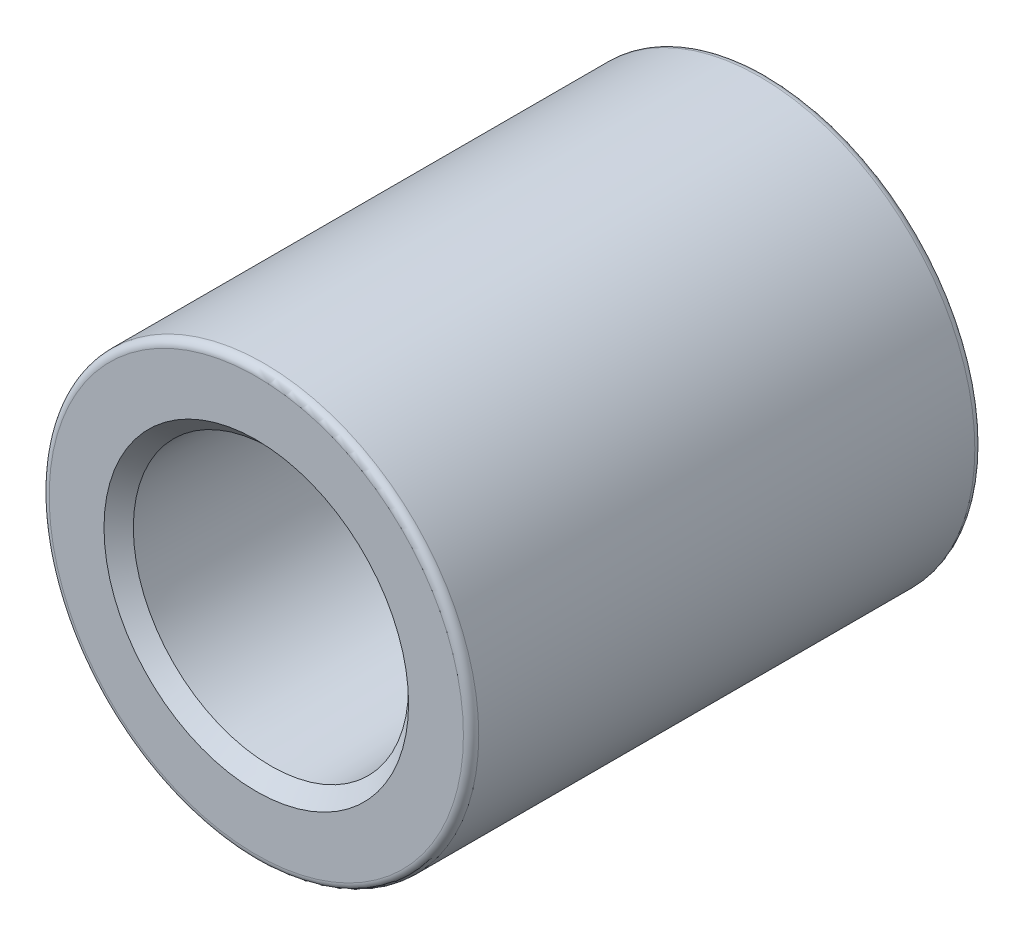
ISO-10303-21;
HEADER;
FILE_DESCRIPTION(('STEP AP214'),'2;1');
FILE_NAME('part.step','',(''),(''),'','','');
FILE_SCHEMA(('AUTOMOTIVE_DESIGN { 1 0 10303 214 1 1 1 1 }'));
ENDSEC;
DATA;
#1=APPLICATION_CONTEXT('core data for automotive mechanical design processes');
#2=APPLICATION_PROTOCOL_DEFINITION('international standard','automotive_design',2000,#1);
#3=PRODUCT_CONTEXT('',#1,'mechanical');
#4=PRODUCT('Part','Part','',(#3));
#5=PRODUCT_RELATED_PRODUCT_CATEGORY('part','',(#4));
#6=PRODUCT_DEFINITION_FORMATION('','',#4);
#7=PRODUCT_DEFINITION_CONTEXT('part definition',#1,'design');
#8=PRODUCT_DEFINITION('design','',#6,#7);
#9=PRODUCT_DEFINITION_SHAPE('','',#8);
#10=(LENGTH_UNIT() NAMED_UNIT(*) SI_UNIT(.MILLI.,.METRE.));
#11=(NAMED_UNIT(*) PLANE_ANGLE_UNIT() SI_UNIT($,.RADIAN.));
#12=(NAMED_UNIT(*) SI_UNIT($,.STERADIAN.) SOLID_ANGLE_UNIT());
#13=UNCERTAINTY_MEASURE_WITH_UNIT(LENGTH_MEASURE(1.E-05),#10,'distance_accuracy_value','');
#14=(GEOMETRIC_REPRESENTATION_CONTEXT(3) GLOBAL_UNCERTAINTY_ASSIGNED_CONTEXT((#13)) GLOBAL_UNIT_ASSIGNED_CONTEXT((#10,
#11,#12)) REPRESENTATION_CONTEXT('',''));
#15=CARTESIAN_POINT('',(0.,0.,0.));
#16=DIRECTION('',(0.,0.,1.));
#17=DIRECTION('',(1.,0.,0.));
#18=AXIS2_PLACEMENT_3D('',#15,#16,#17);
#19=CARTESIAN_POINT('',(0.,0.,12.7));
#20=DIRECTION('',(0.,0.,-1.));
#21=DIRECTION('',(-1.,0.,0.));
#22=AXIS2_PLACEMENT_3D('',#19,#20,#21);
#23=CYLINDRICAL_SURFACE('',#22,10.668);
#24=CARTESIAN_POINT('',(0.,0.,-12.319));
#25=DIRECTION('',(0.,0.,1.));
#26=DIRECTION('',(1.,0.,0.));
#27=AXIS2_PLACEMENT_3D('',#24,#25,#26);
#28=CIRCLE('',#27,10.668);
#29=CARTESIAN_POINT('',(10.668,0.,-12.319));
#30=VERTEX_POINT('',#29);
#31=EDGE_CURVE('E45',#30,#30,#28,.T.);
#32=ORIENTED_EDGE('',*,*,#31,.T.);
#33=EDGE_LOOP('',(#32));
#34=FACE_BOUND('',#33,.T.);
#35=CARTESIAN_POINT('',(0.,0.,12.319));
#36=DIRECTION('',(0.,0.,1.));
#37=DIRECTION('',(1.,0.,0.));
#38=AXIS2_PLACEMENT_3D('',#35,#36,#37);
#39=CIRCLE('',#38,10.668);
#40=CARTESIAN_POINT('',(10.668,0.,12.319));
#41=VERTEX_POINT('',#40);
#42=EDGE_CURVE('E49',#41,#41,#39,.F.);
#43=ORIENTED_EDGE('',*,*,#42,.T.);
#44=EDGE_LOOP('',(#43));
#45=FACE_BOUND('',#44,.T.);
#46=ADVANCED_FACE('F34',(#34,#45),#23,.T.);
#47=CARTESIAN_POINT('',(0.,0.,12.7));
#48=DIRECTION('',(0.,0.,1.));
#49=DIRECTION('',(1.,0.,0.));
#50=AXIS2_PLACEMENT_3D('',#47,#48,#49);
#51=PLANE('',#50);
#52=CARTESIAN_POINT('',(0.,0.,12.7));
#53=DIRECTION('',(0.,0.,1.));
#54=DIRECTION('',(1.,0.,0.));
#55=AXIS2_PLACEMENT_3D('',#52,#53,#54);
#56=CIRCLE('',#55,10.287);
#57=CARTESIAN_POINT('',(10.287,0.,12.7));
#58=VERTEX_POINT('',#57);
#59=EDGE_CURVE('E10',#58,#58,#56,.T.);
#60=ORIENTED_EDGE('',*,*,#59,.T.);
#61=EDGE_LOOP('',(#60));
#62=FACE_BOUND('',#61,.T.);
#63=CARTESIAN_POINT('',(0.,0.,12.7));
#64=DIRECTION('',(0.,0.,1.));
#65=DIRECTION('',(1.,0.,0.));
#66=AXIS2_PLACEMENT_3D('',#63,#64,#65);
#67=CIRCLE('',#66,7.56355555555556);
#68=CARTESIAN_POINT('',(7.56355555555556,0.,12.7));
#69=VERTEX_POINT('',#68);
#70=EDGE_CURVE('E63',#69,#69,#67,.T.);
#71=ORIENTED_EDGE('',*,*,#70,.F.);
#72=EDGE_LOOP('',(#71));
#73=FACE_BOUND('',#72,.T.);
#74=ADVANCED_FACE('F79',(#62,#73),#51,.T.);
#75=CARTESIAN_POINT('',(0.,0.,-12.7));
#76=DIRECTION('',(0.,0.,1.));
#77=DIRECTION('',(1.,0.,0.));
#78=AXIS2_PLACEMENT_3D('',#75,#76,#77);
#79=PLANE('',#78);
#80=CARTESIAN_POINT('',(0.,0.,-12.7));
#81=DIRECTION('',(0.,0.,1.));
#82=DIRECTION('',(1.,0.,0.));
#83=AXIS2_PLACEMENT_3D('',#80,#81,#82);
#84=CIRCLE('',#83,10.287);
#85=CARTESIAN_POINT('',(10.287,0.,-12.7));
#86=VERTEX_POINT('',#85);
#87=EDGE_CURVE('E41',#86,#86,#84,.F.);
#88=ORIENTED_EDGE('',*,*,#87,.T.);
#89=EDGE_LOOP('',(#88));
#90=FACE_BOUND('',#89,.T.);
#91=CARTESIAN_POINT('',(0.,0.,-12.7));
#92=DIRECTION('',(0.,0.,-1.));
#93=DIRECTION('',(-1.,0.,0.));
#94=AXIS2_PLACEMENT_3D('',#91,#92,#93);
#95=CIRCLE('',#94,7.56355555555556);
#96=CARTESIAN_POINT('',(-7.56355555555547,0.,-12.7000000000001));
#97=VERTEX_POINT('',#96);
#98=EDGE_CURVE('E59',#97,#97,#95,.T.);
#99=ORIENTED_EDGE('',*,*,#98,.F.);
#100=EDGE_LOOP('',(#99));
#101=FACE_BOUND('',#100,.T.);
#102=ADVANCED_FACE('F76',(#90,#101),#79,.F.);
#103=CARTESIAN_POINT('',(0.,0.,12.7));
#104=DIRECTION('',(0.,0.,1.));
#105=DIRECTION('',(1.,0.,0.));
#106=AXIS2_PLACEMENT_3D('',#103,#104,#105);
#107=CONICAL_SURFACE('',#106,7.56355555555556,0.78539816339745);
#108=ORIENTED_EDGE('',*,*,#70,.T.);
#109=EDGE_LOOP('',(#108));
#110=FACE_BOUND('',#109,.T.);
#111=CARTESIAN_POINT('',(0.,0.,11.971770965584));
#112=DIRECTION('',(0.,0.,1.));
#113=DIRECTION('',(1.,0.,0.));
#114=AXIS2_PLACEMENT_3D('',#111,#112,#113);
#115=CIRCLE('',#114,6.83532652113954);
#116=CARTESIAN_POINT('',(6.83532652113954,0.,11.971770965584));
#117=VERTEX_POINT('',#116);
#118=EDGE_CURVE('E60',#117,#117,#115,.T.);
#119=ORIENTED_EDGE('',*,*,#118,.F.);
#120=EDGE_LOOP('',(#119));
#121=FACE_BOUND('',#120,.T.);
#122=ADVANCED_FACE('F78',(#110,#121),#107,.F.);
#123=CARTESIAN_POINT('',(0.,0.,2.49428));
#124=DIRECTION('',(0.,0.,1.));
#125=DIRECTION('',(1.,0.,0.));
#126=AXIS2_PLACEMENT_3D('',#123,#124,#125);
#127=PLANE('',#126);
#128=CARTESIAN_POINT('',(0.,0.,2.49428));
#129=DIRECTION('',(0.,0.,1.));
#130=DIRECTION('',(1.,0.,0.));
#131=AXIS2_PLACEMENT_3D('',#128,#129,#130);
#132=CIRCLE('',#131,6.54024395658529);
#133=CARTESIAN_POINT('',(6.54024395658529,0.,2.49428));
#134=VERTEX_POINT('',#133);
#135=EDGE_CURVE('E54',#134,#134,#132,.T.);
#136=ORIENTED_EDGE('',*,*,#135,.T.);
#137=EDGE_LOOP('',(#136));
#138=FACE_BOUND('',#137,.T.);
#139=ADVANCED_FACE('F85',(#138),#127,.T.);
#140=CARTESIAN_POINT('',(0.,0.,12.7));
#141=DIRECTION('',(0.,0.,1.));
#142=DIRECTION('',(1.,0.,0.));
#143=AXIS2_PLACEMENT_3D('',#140,#141,#142);
#144=CONICAL_SURFACE('',#143,6.858,0.0311250383272323);
#145=ORIENTED_EDGE('',*,*,#118,.T.);
#146=EDGE_LOOP('',(#145));
#147=FACE_BOUND('',#146,.T.);
#148=ORIENTED_EDGE('',*,*,#135,.F.);
#149=EDGE_LOOP('',(#148));
#150=FACE_BOUND('',#149,.T.);
#151=ADVANCED_FACE('F119',(#147,#150),#144,.F.);
#152=CARTESIAN_POINT('',(0.,0.,-12.7));
#153=DIRECTION('',(0.,0.,-1.));
#154=DIRECTION('',(-1.,0.,0.));
#155=AXIS2_PLACEMENT_3D('',#152,#153,#154);
#156=CONICAL_SURFACE('',#155,7.56355555555556,0.78539816339745);
#157=ORIENTED_EDGE('',*,*,#98,.T.);
#158=EDGE_LOOP('',(#157));
#159=FACE_BOUND('',#158,.T.);
#160=CARTESIAN_POINT('',(0.,0.,-11.971770965584));
#161=DIRECTION('',(0.,0.,-1.));
#162=DIRECTION('',(-1.,0.,0.));
#163=AXIS2_PLACEMENT_3D('',#160,#161,#162);
#164=CIRCLE('',#163,6.83532652113954);
#165=CARTESIAN_POINT('',(-6.83532652113946,0.,-11.971770965584));
#166=VERTEX_POINT('',#165);
#167=EDGE_CURVE('E55',#166,#166,#164,.T.);
#168=ORIENTED_EDGE('',*,*,#167,.F.);
#169=EDGE_LOOP('',(#168));
#170=FACE_BOUND('',#169,.T.);
#171=ADVANCED_FACE('F73',(#159,#170),#156,.F.);
#172=CARTESIAN_POINT('',(0.,0.,-2.49428));
#173=DIRECTION('',(0.,0.,-1.));
#174=DIRECTION('',(-1.,0.,0.));
#175=AXIS2_PLACEMENT_3D('',#172,#173,#174);
#176=PLANE('',#175);
#177=CARTESIAN_POINT('',(0.,0.,-2.49428));
#178=DIRECTION('',(0.,0.,-1.));
#179=DIRECTION('',(-1.,0.,0.));
#180=AXIS2_PLACEMENT_3D('',#177,#178,#179);
#181=CIRCLE('',#180,6.54024395658529);
#182=CARTESIAN_POINT('',(-6.54024395658527,0.,-2.49428000000005));
#183=VERTEX_POINT('',#182);
#184=EDGE_CURVE('E58',#183,#183,#181,.T.);
#185=ORIENTED_EDGE('',*,*,#184,.T.);
#186=EDGE_LOOP('',(#185));
#187=FACE_BOUND('',#186,.T.);
#188=ADVANCED_FACE('F104',(#187),#176,.T.);
#189=CARTESIAN_POINT('',(0.,0.,-12.7));
#190=DIRECTION('',(0.,0.,-1.));
#191=DIRECTION('',(-1.,0.,0.));
#192=AXIS2_PLACEMENT_3D('',#189,#190,#191);
#193=CONICAL_SURFACE('',#192,6.858,0.0311250383272323);
#194=ORIENTED_EDGE('',*,*,#167,.T.);
#195=EDGE_LOOP('',(#194));
#196=FACE_BOUND('',#195,.T.);
#197=ORIENTED_EDGE('',*,*,#184,.F.);
#198=EDGE_LOOP('',(#197));
#199=FACE_BOUND('',#198,.T.);
#200=ADVANCED_FACE('F97',(#196,#199),#193,.F.);
#201=CARTESIAN_POINT('',(0.,0.,-12.319));
#202=DIRECTION('',(0.,0.,1.));
#203=DIRECTION('',(1.,0.,0.));
#204=AXIS2_PLACEMENT_3D('',#201,#202,#203);
#205=TOROIDAL_SURFACE('',#204,10.287,0.381);
#206=ORIENTED_EDGE('',*,*,#87,.F.);
#207=EDGE_LOOP('',(#206));
#208=FACE_BOUND('',#207,.T.);
#209=ORIENTED_EDGE('',*,*,#31,.F.);
#210=EDGE_LOOP('',(#209));
#211=FACE_BOUND('',#210,.T.);
#212=ADVANCED_FACE('F95',(#208,#211),#205,.T.);
#213=CARTESIAN_POINT('',(0.,0.,12.319));
#214=DIRECTION('',(0.,0.,1.));
#215=DIRECTION('',(1.,0.,0.));
#216=AXIS2_PLACEMENT_3D('',#213,#214,#215);
#217=TOROIDAL_SURFACE('',#216,10.287,0.381);
#218=ORIENTED_EDGE('',*,*,#42,.F.);
#219=EDGE_LOOP('',(#218));
#220=FACE_BOUND('',#219,.T.);
#221=ORIENTED_EDGE('',*,*,#59,.F.);
#222=EDGE_LOOP('',(#221));
#223=FACE_BOUND('',#222,.T.);
#224=ADVANCED_FACE('F36',(#220,#223),#217,.T.);
#225=CLOSED_SHELL('',(#46,#74,#102,#122,#139,#151,#171,#188,#200,#212,#224));
#226=MANIFOLD_SOLID_BREP('B2',#225);
#227=ADVANCED_BREP_SHAPE_REPRESENTATION('',(#18,#226),#14);
#228=SHAPE_DEFINITION_REPRESENTATION(#9,#227);
ENDSEC;
END-ISO-10303-21;
